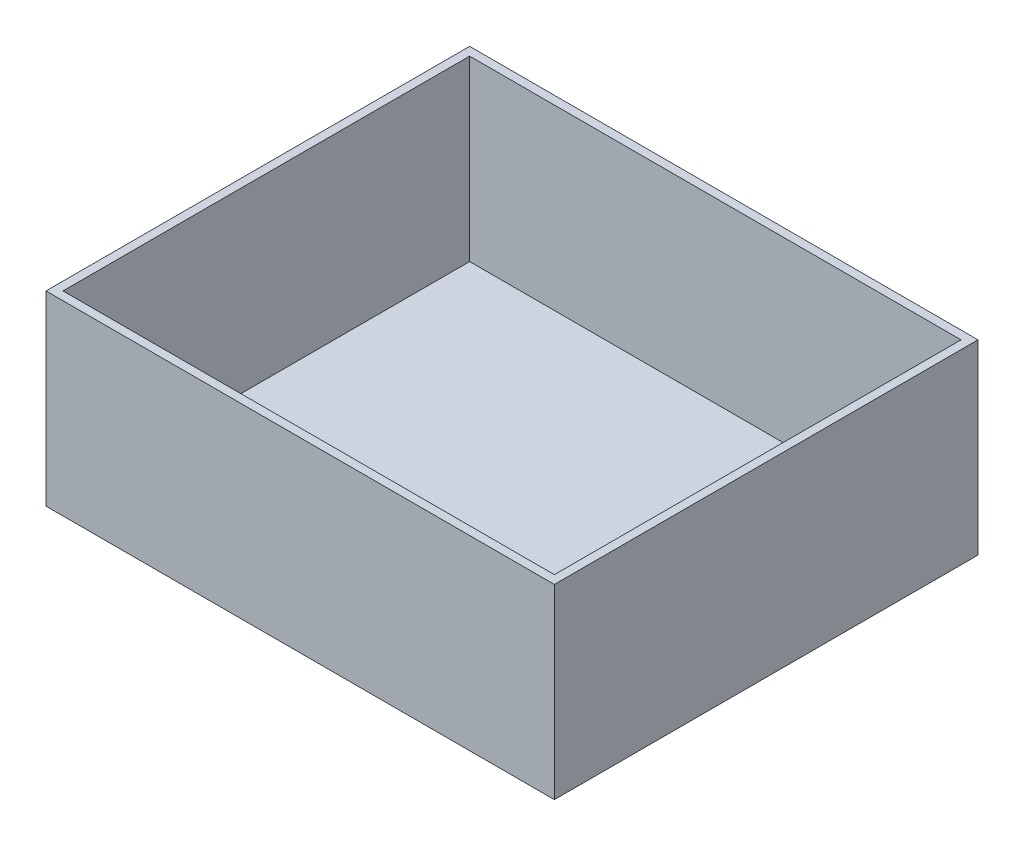
ISO-10303-21;
HEADER;
FILE_DESCRIPTION(('STEP AP214'),'2;1');
FILE_NAME('part.step','',(''),(''),'','','');
FILE_SCHEMA(('AUTOMOTIVE_DESIGN { 1 0 10303 214 1 1 1 1 }'));
ENDSEC;
DATA;
#1=APPLICATION_CONTEXT('core data for automotive mechanical design processes');
#2=APPLICATION_PROTOCOL_DEFINITION('international standard','automotive_design',2000,#1);
#3=PRODUCT_CONTEXT('',#1,'mechanical');
#4=PRODUCT('Part','Part','',(#3));
#5=PRODUCT_RELATED_PRODUCT_CATEGORY('part','',(#4));
#6=PRODUCT_DEFINITION_FORMATION('','',#4);
#7=PRODUCT_DEFINITION_CONTEXT('part definition',#1,'design');
#8=PRODUCT_DEFINITION('design','',#6,#7);
#9=PRODUCT_DEFINITION_SHAPE('','',#8);
#10=(LENGTH_UNIT() NAMED_UNIT(*) SI_UNIT(.MILLI.,.METRE.));
#11=(NAMED_UNIT(*) PLANE_ANGLE_UNIT() SI_UNIT($,.RADIAN.));
#12=(NAMED_UNIT(*) SI_UNIT($,.STERADIAN.) SOLID_ANGLE_UNIT());
#13=UNCERTAINTY_MEASURE_WITH_UNIT(LENGTH_MEASURE(1.E-05),#10,'distance_accuracy_value','');
#14=(GEOMETRIC_REPRESENTATION_CONTEXT(3) GLOBAL_UNCERTAINTY_ASSIGNED_CONTEXT((#13)) GLOBAL_UNIT_ASSIGNED_CONTEXT((#10,
#11,#12)) REPRESENTATION_CONTEXT('',''));
#15=CARTESIAN_POINT('',(0.,0.,0.));
#16=DIRECTION('',(0.,0.,1.));
#17=DIRECTION('',(1.,0.,0.));
#18=AXIS2_PLACEMENT_3D('',#15,#16,#17);
#19=CARTESIAN_POINT('',(90.,66.,-75.));
#20=DIRECTION('',(-1.,0.,0.));
#21=DIRECTION('',(0.,0.,1.));
#22=AXIS2_PLACEMENT_3D('',#19,#20,#21);
#23=PLANE('',#22);
#24=DIRECTION('',(0.,0.,-1.));
#25=VECTOR('',#24,1.);
#26=CARTESIAN_POINT('',(90.,0.,-75.));
#27=LINE('',#26,#25);
#28=CARTESIAN_POINT('',(90.,0.,75.));
#29=VERTEX_POINT('',#28);
#30=CARTESIAN_POINT('',(90.,0.,-75.));
#31=VERTEX_POINT('',#30);
#32=EDGE_CURVE('E148',#29,#31,#27,.T.);
#33=ORIENTED_EDGE('',*,*,#32,.T.);
#34=DIRECTION('',(0.,-1.,0.));
#35=VECTOR('',#34,1.);
#36=CARTESIAN_POINT('',(90.,66.,-75.));
#37=LINE('',#36,#35);
#38=CARTESIAN_POINT('',(90.,66.,-75.));
#39=VERTEX_POINT('',#38);
#40=EDGE_CURVE('E11',#39,#31,#37,.T.);
#41=ORIENTED_EDGE('',*,*,#40,.F.);
#42=DIRECTION('',(0.,0.,-1.));
#43=VECTOR('',#42,1.);
#44=CARTESIAN_POINT('',(90.,66.,-75.));
#45=LINE('',#44,#43);
#46=CARTESIAN_POINT('',(90.,66.,75.));
#47=VERTEX_POINT('',#46);
#48=EDGE_CURVE('E141',#47,#39,#45,.T.);
#49=ORIENTED_EDGE('',*,*,#48,.F.);
#50=DIRECTION('',(0.,-1.,0.));
#51=VECTOR('',#50,1.);
#52=CARTESIAN_POINT('',(90.,66.,75.));
#53=LINE('',#52,#51);
#54=EDGE_CURVE('E147',#47,#29,#53,.T.);
#55=ORIENTED_EDGE('',*,*,#54,.T.);
#56=EDGE_LOOP('',(#33,#41,#49,#55));
#57=FACE_BOUND('',#56,.T.);
#58=ADVANCED_FACE('F34',(#57),#23,.F.);
#59=CARTESIAN_POINT('',(-90.,66.,-75.));
#60=DIRECTION('',(0.,0.,1.));
#61=DIRECTION('',(1.,0.,0.));
#62=AXIS2_PLACEMENT_3D('',#59,#60,#61);
#63=PLANE('',#62);
#64=DIRECTION('',(-1.,0.,0.));
#65=VECTOR('',#64,1.);
#66=CARTESIAN_POINT('',(-90.,0.,-75.));
#67=LINE('',#66,#65);
#68=CARTESIAN_POINT('',(-90.,0.,-75.));
#69=VERTEX_POINT('',#68);
#70=EDGE_CURVE('E151',#31,#69,#67,.T.);
#71=ORIENTED_EDGE('',*,*,#70,.T.);
#72=DIRECTION('',(0.,-1.,0.));
#73=VECTOR('',#72,1.);
#74=CARTESIAN_POINT('',(-90.,66.,-75.));
#75=LINE('',#74,#73);
#76=CARTESIAN_POINT('',(-90.,66.,-75.));
#77=VERTEX_POINT('',#76);
#78=EDGE_CURVE('E41',#77,#69,#75,.T.);
#79=ORIENTED_EDGE('',*,*,#78,.F.);
#80=DIRECTION('',(-1.,0.,0.));
#81=VECTOR('',#80,1.);
#82=CARTESIAN_POINT('',(-90.,66.,-75.));
#83=LINE('',#82,#81);
#84=EDGE_CURVE('E85',#39,#77,#83,.T.);
#85=ORIENTED_EDGE('',*,*,#84,.F.);
#86=ORIENTED_EDGE('',*,*,#40,.T.);
#87=EDGE_LOOP('',(#71,#79,#85,#86));
#88=FACE_BOUND('',#87,.T.);
#89=ADVANCED_FACE('F180',(#88),#63,.F.);
#90=CARTESIAN_POINT('',(-90.,66.,-75.));
#91=DIRECTION('',(1.,0.,0.));
#92=DIRECTION('',(0.,0.,-1.));
#93=AXIS2_PLACEMENT_3D('',#90,#91,#92);
#94=PLANE('',#93);
#95=DIRECTION('',(0.,0.,1.));
#96=VECTOR('',#95,1.);
#97=CARTESIAN_POINT('',(-90.,0.,-75.));
#98=LINE('',#97,#96);
#99=CARTESIAN_POINT('',(-90.,0.,75.));
#100=VERTEX_POINT('',#99);
#101=EDGE_CURVE('E153',#69,#100,#98,.T.);
#102=ORIENTED_EDGE('',*,*,#101,.T.);
#103=DIRECTION('',(0.,-1.,0.));
#104=VECTOR('',#103,1.);
#105=CARTESIAN_POINT('',(-90.,66.,75.));
#106=LINE('',#105,#104);
#107=CARTESIAN_POINT('',(-90.,66.,75.));
#108=VERTEX_POINT('',#107);
#109=EDGE_CURVE('E157',#108,#100,#106,.T.);
#110=ORIENTED_EDGE('',*,*,#109,.F.);
#111=DIRECTION('',(0.,0.,1.));
#112=VECTOR('',#111,1.);
#113=CARTESIAN_POINT('',(-90.,66.,-75.));
#114=LINE('',#113,#112);
#115=EDGE_CURVE('E144',#77,#108,#114,.T.);
#116=ORIENTED_EDGE('',*,*,#115,.F.);
#117=ORIENTED_EDGE('',*,*,#78,.T.);
#118=EDGE_LOOP('',(#102,#110,#116,#117));
#119=FACE_BOUND('',#118,.T.);
#120=ADVANCED_FACE('F162',(#119),#94,.F.);
#121=CARTESIAN_POINT('',(-90.,66.,75.));
#122=DIRECTION('',(0.,0.,-1.));
#123=DIRECTION('',(-1.,0.,0.));
#124=AXIS2_PLACEMENT_3D('',#121,#122,#123);
#125=PLANE('',#124);
#126=DIRECTION('',(1.,0.,0.));
#127=VECTOR('',#126,1.);
#128=CARTESIAN_POINT('',(-90.,0.,75.));
#129=LINE('',#128,#127);
#130=EDGE_CURVE('E78',#100,#29,#129,.T.);
#131=ORIENTED_EDGE('',*,*,#130,.T.);
#132=ORIENTED_EDGE('',*,*,#54,.F.);
#133=DIRECTION('',(1.,0.,0.));
#134=VECTOR('',#133,1.);
#135=CARTESIAN_POINT('',(-90.,66.,75.));
#136=LINE('',#135,#134);
#137=EDGE_CURVE('E57',#108,#47,#136,.T.);
#138=ORIENTED_EDGE('',*,*,#137,.F.);
#139=ORIENTED_EDGE('',*,*,#109,.T.);
#140=EDGE_LOOP('',(#131,#132,#138,#139));
#141=FACE_BOUND('',#140,.T.);
#142=ADVANCED_FACE('F170',(#141),#125,.F.);
#143=CARTESIAN_POINT('',(0.,66.,0.));
#144=DIRECTION('',(0.,1.,0.));
#145=DIRECTION('',(0.,0.,1.));
#146=AXIS2_PLACEMENT_3D('',#143,#144,#145);
#147=PLANE('',#146);
#148=DIRECTION('',(0.,0.,-1.));
#149=VECTOR('',#148,1.);
#150=CARTESIAN_POINT('',(87.,66.,-75.));
#151=LINE('',#150,#149);
#152=CARTESIAN_POINT('',(87.,66.,72.));
#153=VERTEX_POINT('',#152);
#154=CARTESIAN_POINT('',(87.,66.,-72.));
#155=VERTEX_POINT('',#154);
#156=EDGE_CURVE('E130',#153,#155,#151,.T.);
#157=ORIENTED_EDGE('',*,*,#156,.F.);
#158=DIRECTION('',(1.,0.,0.));
#159=VECTOR('',#158,1.);
#160=CARTESIAN_POINT('',(-90.,66.,72.));
#161=LINE('',#160,#159);
#162=CARTESIAN_POINT('',(-87.,66.,72.));
#163=VERTEX_POINT('',#162);
#164=EDGE_CURVE('E139',#163,#153,#161,.T.);
#165=ORIENTED_EDGE('',*,*,#164,.F.);
#166=DIRECTION('',(0.,0.,1.));
#167=VECTOR('',#166,1.);
#168=CARTESIAN_POINT('',(-87.,66.,-75.));
#169=LINE('',#168,#167);
#170=CARTESIAN_POINT('',(-87.,66.,-72.));
#171=VERTEX_POINT('',#170);
#172=EDGE_CURVE('E137',#171,#163,#169,.T.);
#173=ORIENTED_EDGE('',*,*,#172,.F.);
#174=DIRECTION('',(-1.,0.,0.));
#175=VECTOR('',#174,1.);
#176=CARTESIAN_POINT('',(-90.,66.,-72.));
#177=LINE('',#176,#175);
#178=EDGE_CURVE('E122',#155,#171,#177,.T.);
#179=ORIENTED_EDGE('',*,*,#178,.F.);
#180=EDGE_LOOP('',(#157,#165,#173,#179));
#181=FACE_BOUND('',#180,.T.);
#182=ORIENTED_EDGE('',*,*,#48,.T.);
#183=ORIENTED_EDGE('',*,*,#84,.T.);
#184=ORIENTED_EDGE('',*,*,#115,.T.);
#185=ORIENTED_EDGE('',*,*,#137,.T.);
#186=EDGE_LOOP('',(#182,#183,#184,#185));
#187=FACE_BOUND('',#186,.T.);
#188=ADVANCED_FACE('F172',(#181,#187),#147,.T.);
#189=CARTESIAN_POINT('',(0.,0.,0.));
#190=DIRECTION('',(0.,1.,0.));
#191=DIRECTION('',(0.,0.,1.));
#192=AXIS2_PLACEMENT_3D('',#189,#190,#191);
#193=PLANE('',#192);
#194=ORIENTED_EDGE('',*,*,#32,.F.);
#195=ORIENTED_EDGE('',*,*,#130,.F.);
#196=ORIENTED_EDGE('',*,*,#101,.F.);
#197=ORIENTED_EDGE('',*,*,#70,.F.);
#198=EDGE_LOOP('',(#194,#195,#196,#197));
#199=FACE_BOUND('',#198,.T.);
#200=ADVANCED_FACE('F166',(#199),#193,.F.);
#201=CARTESIAN_POINT('',(87.,66.,-75.));
#202=DIRECTION('',(-1.,0.,0.));
#203=DIRECTION('',(0.,0.,1.));
#204=AXIS2_PLACEMENT_3D('',#201,#202,#203);
#205=PLANE('',#204);
#206=DIRECTION('',(0.,0.,-1.));
#207=VECTOR('',#206,1.);
#208=CARTESIAN_POINT('',(87.,3.,-75.));
#209=LINE('',#208,#207);
#210=CARTESIAN_POINT('',(87.,3.,72.));
#211=VERTEX_POINT('',#210);
#212=CARTESIAN_POINT('',(87.,3.,-72.));
#213=VERTEX_POINT('',#212);
#214=EDGE_CURVE('E113',#211,#213,#209,.T.);
#215=ORIENTED_EDGE('',*,*,#214,.F.);
#216=DIRECTION('',(0.,-1.,0.));
#217=VECTOR('',#216,1.);
#218=CARTESIAN_POINT('',(87.,66.,72.));
#219=LINE('',#218,#217);
#220=EDGE_CURVE('E133',#153,#211,#219,.T.);
#221=ORIENTED_EDGE('',*,*,#220,.F.);
#222=ORIENTED_EDGE('',*,*,#156,.T.);
#223=DIRECTION('',(0.,-1.,0.));
#224=VECTOR('',#223,1.);
#225=CARTESIAN_POINT('',(87.,66.,-72.));
#226=LINE('',#225,#224);
#227=EDGE_CURVE('E125',#155,#213,#226,.T.);
#228=ORIENTED_EDGE('',*,*,#227,.T.);
#229=EDGE_LOOP('',(#215,#221,#222,#228));
#230=FACE_BOUND('',#229,.T.);
#231=ADVANCED_FACE('F207',(#230),#205,.T.);
#232=CARTESIAN_POINT('',(-90.,66.,-72.));
#233=DIRECTION('',(0.,0.,1.));
#234=DIRECTION('',(1.,0.,0.));
#235=AXIS2_PLACEMENT_3D('',#232,#233,#234);
#236=PLANE('',#235);
#237=DIRECTION('',(-1.,0.,0.));
#238=VECTOR('',#237,1.);
#239=CARTESIAN_POINT('',(-90.,3.,-72.));
#240=LINE('',#239,#238);
#241=CARTESIAN_POINT('',(-87.,3.,-72.));
#242=VERTEX_POINT('',#241);
#243=EDGE_CURVE('E107',#213,#242,#240,.T.);
#244=ORIENTED_EDGE('',*,*,#243,.F.);
#245=ORIENTED_EDGE('',*,*,#227,.F.);
#246=ORIENTED_EDGE('',*,*,#178,.T.);
#247=DIRECTION('',(0.,-1.,0.));
#248=VECTOR('',#247,1.);
#249=CARTESIAN_POINT('',(-87.,66.,-72.));
#250=LINE('',#249,#248);
#251=EDGE_CURVE('E119',#171,#242,#250,.T.);
#252=ORIENTED_EDGE('',*,*,#251,.T.);
#253=EDGE_LOOP('',(#244,#245,#246,#252));
#254=FACE_BOUND('',#253,.T.);
#255=ADVANCED_FACE('F120',(#254),#236,.T.);
#256=CARTESIAN_POINT('',(-87.,66.,-75.));
#257=DIRECTION('',(1.,0.,0.));
#258=DIRECTION('',(0.,0.,-1.));
#259=AXIS2_PLACEMENT_3D('',#256,#257,#258);
#260=PLANE('',#259);
#261=DIRECTION('',(0.,0.,1.));
#262=VECTOR('',#261,1.);
#263=CARTESIAN_POINT('',(-87.,3.,-75.));
#264=LINE('',#263,#262);
#265=CARTESIAN_POINT('',(-87.,3.,72.));
#266=VERTEX_POINT('',#265);
#267=EDGE_CURVE('E111',#242,#266,#264,.T.);
#268=ORIENTED_EDGE('',*,*,#267,.F.);
#269=ORIENTED_EDGE('',*,*,#251,.F.);
#270=ORIENTED_EDGE('',*,*,#172,.T.);
#271=DIRECTION('',(0.,-1.,0.));
#272=VECTOR('',#271,1.);
#273=CARTESIAN_POINT('',(-87.,66.,72.));
#274=LINE('',#273,#272);
#275=EDGE_CURVE('E48',#163,#266,#274,.T.);
#276=ORIENTED_EDGE('',*,*,#275,.T.);
#277=EDGE_LOOP('',(#268,#269,#270,#276));
#278=FACE_BOUND('',#277,.T.);
#279=ADVANCED_FACE('F127',(#278),#260,.T.);
#280=CARTESIAN_POINT('',(-90.,66.,72.));
#281=DIRECTION('',(0.,0.,-1.));
#282=DIRECTION('',(-1.,0.,0.));
#283=AXIS2_PLACEMENT_3D('',#280,#281,#282);
#284=PLANE('',#283);
#285=DIRECTION('',(1.,0.,0.));
#286=VECTOR('',#285,1.);
#287=CARTESIAN_POINT('',(-90.,3.,72.));
#288=LINE('',#287,#286);
#289=EDGE_CURVE('E128',#266,#211,#288,.T.);
#290=ORIENTED_EDGE('',*,*,#289,.F.);
#291=ORIENTED_EDGE('',*,*,#275,.F.);
#292=ORIENTED_EDGE('',*,*,#164,.T.);
#293=ORIENTED_EDGE('',*,*,#220,.T.);
#294=EDGE_LOOP('',(#290,#291,#292,#293));
#295=FACE_BOUND('',#294,.T.);
#296=ADVANCED_FACE('F237',(#295),#284,.T.);
#297=CARTESIAN_POINT('',(0.,3.,0.));
#298=DIRECTION('',(0.,1.,0.));
#299=DIRECTION('',(0.,0.,1.));
#300=AXIS2_PLACEMENT_3D('',#297,#298,#299);
#301=PLANE('',#300);
#302=ORIENTED_EDGE('',*,*,#214,.T.);
#303=ORIENTED_EDGE('',*,*,#243,.T.);
#304=ORIENTED_EDGE('',*,*,#267,.T.);
#305=ORIENTED_EDGE('',*,*,#289,.T.);
#306=EDGE_LOOP('',(#302,#303,#304,#305));
#307=FACE_BOUND('',#306,.T.);
#308=ADVANCED_FACE('F109',(#307),#301,.T.);
#309=CLOSED_SHELL('',(#58,#89,#120,#142,#188,#200,#231,#255,#279,#296,#308));
#310=MANIFOLD_SOLID_BREP('B2',#309);
#311=ADVANCED_BREP_SHAPE_REPRESENTATION('',(#18,#310),#14);
#312=SHAPE_DEFINITION_REPRESENTATION(#9,#311);
ENDSEC;
END-ISO-10303-21;
